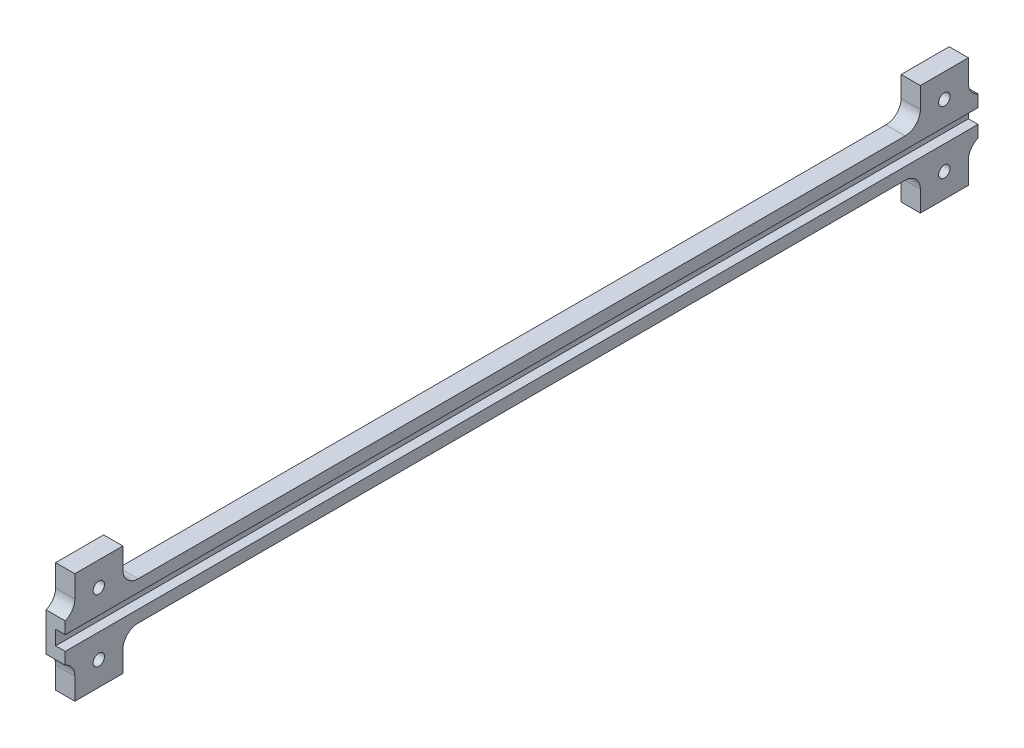
ISO-10303-21;
HEADER;
FILE_DESCRIPTION(('STEP AP214'),'2;1');
FILE_NAME('part.step','',(''),(''),'','','');
FILE_SCHEMA(('AUTOMOTIVE_DESIGN { 1 0 10303 214 1 1 1 1 }'));
ENDSEC;
DATA;
#1=APPLICATION_CONTEXT('core data for automotive mechanical design processes');
#2=APPLICATION_PROTOCOL_DEFINITION('international standard','automotive_design',2000,#1);
#3=PRODUCT_CONTEXT('',#1,'mechanical');
#4=PRODUCT('Part','Part','',(#3));
#5=PRODUCT_RELATED_PRODUCT_CATEGORY('part','',(#4));
#6=PRODUCT_DEFINITION_FORMATION('','',#4);
#7=PRODUCT_DEFINITION_CONTEXT('part definition',#1,'design');
#8=PRODUCT_DEFINITION('design','',#6,#7);
#9=PRODUCT_DEFINITION_SHAPE('','',#8);
#10=(LENGTH_UNIT() NAMED_UNIT(*) SI_UNIT(.MILLI.,.METRE.));
#11=(NAMED_UNIT(*) PLANE_ANGLE_UNIT() SI_UNIT($,.RADIAN.));
#12=(NAMED_UNIT(*) SI_UNIT($,.STERADIAN.) SOLID_ANGLE_UNIT());
#13=UNCERTAINTY_MEASURE_WITH_UNIT(LENGTH_MEASURE(1.E-05),#10,'distance_accuracy_value','');
#14=(GEOMETRIC_REPRESENTATION_CONTEXT(3) GLOBAL_UNCERTAINTY_ASSIGNED_CONTEXT((#13)) GLOBAL_UNIT_ASSIGNED_CONTEXT((#10,
#11,#12)) REPRESENTATION_CONTEXT('',''));
#15=CARTESIAN_POINT('',(0.,0.,0.));
#16=DIRECTION('',(0.,0.,1.));
#17=DIRECTION('',(1.,0.,0.));
#18=AXIS2_PLACEMENT_3D('',#15,#16,#17);
#19=CARTESIAN_POINT('',(-0.999999999999999,-2.,95.));
#20=DIRECTION('',(0.,1.,0.));
#21=DIRECTION('',(0.,0.,1.));
#22=AXIS2_PLACEMENT_3D('',#19,#20,#21);
#23=PLANE('',#22);
#24=DIRECTION('',(0.,0.,-1.));
#25=VECTOR('',#24,1.);
#26=CARTESIAN_POINT('',(1.,-2.,95.));
#27=LINE('',#26,#25);
#28=CARTESIAN_POINT('',(1.,-2.,87.4125));
#29=VERTEX_POINT('',#28);
#30=CARTESIAN_POINT('',(1.,-2.,7.58750000000001));
#31=VERTEX_POINT('',#30);
#32=EDGE_CURVE('E453',#29,#31,#27,.T.);
#33=ORIENTED_EDGE('',*,*,#32,.F.);
#34=DIRECTION('',(-1.,0.,0.));
#35=VECTOR('',#34,1.);
#36=CARTESIAN_POINT('',(-0.999999999999999,-2.,87.4125));
#37=LINE('',#36,#35);
#38=CARTESIAN_POINT('',(-0.999999999999999,-2.,87.4125));
#39=VERTEX_POINT('',#38);
#40=EDGE_CURVE('E469',#29,#39,#37,.T.);
#41=ORIENTED_EDGE('',*,*,#40,.T.);
#42=DIRECTION('',(0.,0.,-1.));
#43=VECTOR('',#42,1.);
#44=CARTESIAN_POINT('',(-0.999999999999999,-2.,95.));
#45=LINE('',#44,#43);
#46=CARTESIAN_POINT('',(-0.999999999999999,-2.,7.58750000000001));
#47=VERTEX_POINT('',#46);
#48=EDGE_CURVE('E457',#39,#47,#45,.T.);
#49=ORIENTED_EDGE('',*,*,#48,.T.);
#50=DIRECTION('',(1.,0.,0.));
#51=VECTOR('',#50,1.);
#52=CARTESIAN_POINT('',(-0.999999999999999,-2.,7.58750000000001));
#53=LINE('',#52,#51);
#54=EDGE_CURVE('E465',#47,#31,#53,.T.);
#55=ORIENTED_EDGE('',*,*,#54,.T.);
#56=EDGE_LOOP('',(#33,#41,#49,#55));
#57=FACE_BOUND('',#56,.T.);
#58=ADVANCED_FACE('F41',(#57),#23,.F.);
#59=CARTESIAN_POINT('',(1.,2.,95.));
#60=DIRECTION('',(0.,-1.,0.));
#61=DIRECTION('',(0.,0.,-1.));
#62=AXIS2_PLACEMENT_3D('',#59,#60,#61);
#63=PLANE('',#62);
#64=DIRECTION('',(0.,0.,-1.));
#65=VECTOR('',#64,1.);
#66=CARTESIAN_POINT('',(-0.999999999999999,2.,95.));
#67=LINE('',#66,#65);
#68=CARTESIAN_POINT('',(-0.999999999999999,2.,87.4125));
#69=VERTEX_POINT('',#68);
#70=CARTESIAN_POINT('',(-0.999999999999999,2.,7.58750000000001));
#71=VERTEX_POINT('',#70);
#72=EDGE_CURVE('E461',#69,#71,#67,.T.);
#73=ORIENTED_EDGE('',*,*,#72,.F.);
#74=DIRECTION('',(1.,0.,0.));
#75=VECTOR('',#74,1.);
#76=CARTESIAN_POINT('',(1.,2.,87.4125));
#77=LINE('',#76,#75);
#78=CARTESIAN_POINT('',(1.,2.,87.4125));
#79=VERTEX_POINT('',#78);
#80=EDGE_CURVE('E480',#69,#79,#77,.T.);
#81=ORIENTED_EDGE('',*,*,#80,.T.);
#82=DIRECTION('',(0.,0.,-1.));
#83=VECTOR('',#82,1.);
#84=CARTESIAN_POINT('',(1.,2.,95.));
#85=LINE('',#84,#83);
#86=CARTESIAN_POINT('',(1.,2.,7.58750000000001));
#87=VERTEX_POINT('',#86);
#88=EDGE_CURVE('E407',#79,#87,#85,.T.);
#89=ORIENTED_EDGE('',*,*,#88,.T.);
#90=DIRECTION('',(-1.,0.,0.));
#91=VECTOR('',#90,1.);
#92=CARTESIAN_POINT('',(1.,2.,7.58750000000001));
#93=LINE('',#92,#91);
#94=EDGE_CURVE('E476',#87,#71,#93,.T.);
#95=ORIENTED_EDGE('',*,*,#94,.T.);
#96=EDGE_LOOP('',(#73,#81,#89,#95));
#97=FACE_BOUND('',#96,.T.);
#98=ADVANCED_FACE('F642',(#97),#63,.F.);
#99=CARTESIAN_POINT('',(-0.999999999999999,2.,95.));
#100=DIRECTION('',(1.,0.,0.));
#101=DIRECTION('',(0.,0.,-1.));
#102=AXIS2_PLACEMENT_3D('',#99,#100,#101);
#103=PLANE('',#102);
#104=CARTESIAN_POINT('',(-0.999999999999999,3.25,91.5));
#105=DIRECTION('',(1.,0.,0.));
#106=DIRECTION('',(0.,0.,-1.));
#107=AXIS2_PLACEMENT_3D('',#104,#105,#106);
#108=CIRCLE('',#107,0.595629999999988);
#109=CARTESIAN_POINT('',(-0.999999999999999,3.25,90.90437));
#110=VERTEX_POINT('',#109);
#111=EDGE_CURVE('E45',#110,#110,#108,.T.);
#112=ORIENTED_EDGE('',*,*,#111,.T.);
#113=EDGE_LOOP('',(#112));
#114=FACE_BOUND('',#113,.T.);
#115=CARTESIAN_POINT('',(-0.999999999999999,-3.25,3.5));
#116=DIRECTION('',(1.,0.,0.));
#117=DIRECTION('',(0.,0.,-1.));
#118=AXIS2_PLACEMENT_3D('',#115,#116,#117);
#119=CIRCLE('',#118,0.595629999999988);
#120=CARTESIAN_POINT('',(-0.999999999999999,-3.25,2.90437000000001));
#121=VERTEX_POINT('',#120);
#122=EDGE_CURVE('E547',#121,#121,#119,.T.);
#123=ORIENTED_EDGE('',*,*,#122,.T.);
#124=EDGE_LOOP('',(#123));
#125=FACE_BOUND('',#124,.T.);
#126=CARTESIAN_POINT('',(-0.999999999999999,-3.25,91.5));
#127=DIRECTION('',(1.,0.,0.));
#128=DIRECTION('',(0.,0.,-1.));
#129=AXIS2_PLACEMENT_3D('',#126,#127,#128);
#130=CIRCLE('',#129,0.595629999999988);
#131=CARTESIAN_POINT('',(-0.999999999999999,-3.25,90.90437));
#132=VERTEX_POINT('',#131);
#133=EDGE_CURVE('E543',#132,#132,#130,.T.);
#134=ORIENTED_EDGE('',*,*,#133,.T.);
#135=EDGE_LOOP('',(#134));
#136=FACE_BOUND('',#135,.T.);
#137=CARTESIAN_POINT('',(-0.999999999999999,3.25,3.5));
#138=DIRECTION('',(1.,0.,0.));
#139=DIRECTION('',(0.,0.,-1.));
#140=AXIS2_PLACEMENT_3D('',#137,#138,#139);
#141=CIRCLE('',#140,0.595629999999988);
#142=CARTESIAN_POINT('',(-0.999999999999999,3.25,2.90437000000001));
#143=VERTEX_POINT('',#142);
#144=EDGE_CURVE('E568',#143,#143,#141,.T.);
#145=ORIENTED_EDGE('',*,*,#144,.T.);
#146=EDGE_LOOP('',(#145));
#147=FACE_BOUND('',#146,.T.);
#148=ORIENTED_EDGE('',*,*,#48,.F.);
#149=CARTESIAN_POINT('',(-0.999999999999999,-3.5875,87.4125));
#150=DIRECTION('',(1.,0.,0.));
#151=DIRECTION('',(0.,0.,-1.));
#152=AXIS2_PLACEMENT_3D('',#149,#150,#151);
#153=CIRCLE('',#152,1.5875);
#154=CARTESIAN_POINT('',(-0.999999999999999,-3.5875,89.));
#155=VERTEX_POINT('',#154);
#156=EDGE_CURVE('E503',#39,#155,#153,.T.);
#157=ORIENTED_EDGE('',*,*,#156,.T.);
#158=DIRECTION('',(0.,-1.,0.));
#159=VECTOR('',#158,1.);
#160=CARTESIAN_POINT('',(-0.999999999999999,-0.75,89.));
#161=LINE('',#160,#159);
#162=CARTESIAN_POINT('',(-0.999999999999999,-5.75,89.));
#163=VERTEX_POINT('',#162);
#164=EDGE_CURVE('E315',#155,#163,#161,.T.);
#165=ORIENTED_EDGE('',*,*,#164,.T.);
#166=DIRECTION('',(0.,0.,1.));
#167=VECTOR('',#166,1.);
#168=CARTESIAN_POINT('',(-0.999999999999999,-5.75,89.));
#169=LINE('',#168,#167);
#170=CARTESIAN_POINT('',(-0.999999999999999,-5.75,94.));
#171=VERTEX_POINT('',#170);
#172=EDGE_CURVE('E574',#163,#171,#169,.T.);
#173=ORIENTED_EDGE('',*,*,#172,.T.);
#174=DIRECTION('',(0.,1.,0.));
#175=VECTOR('',#174,1.);
#176=CARTESIAN_POINT('',(-0.999999999999999,-0.750000000000001,94.));
#177=LINE('',#176,#175);
#178=CARTESIAN_POINT('',(-0.999999999999999,-3.47478812037526,94.));
#179=VERTEX_POINT('',#178);
#180=EDGE_CURVE('E285',#171,#179,#177,.T.);
#181=ORIENTED_EDGE('',*,*,#180,.T.);
#182=CARTESIAN_POINT('',(-0.999999999999999,-3.47478812037526,95.5875));
#183=DIRECTION('',(1.,0.,0.));
#184=DIRECTION('',(0.,0.,-1.));
#185=AXIS2_PLACEMENT_3D('',#182,#183,#184);
#186=CIRCLE('',#185,1.5875);
#187=CARTESIAN_POINT('',(-0.999999999999999,-2.,95.));
#188=VERTEX_POINT('',#187);
#189=EDGE_CURVE('E540',#179,#188,#186,.T.);
#190=ORIENTED_EDGE('',*,*,#189,.T.);
#191=DIRECTION('',(0.,-1.,0.));
#192=VECTOR('',#191,1.);
#193=CARTESIAN_POINT('',(-0.999999999999999,2.,95.));
#194=LINE('',#193,#192);
#195=CARTESIAN_POINT('',(-0.999999999999999,2.,95.));
#196=VERTEX_POINT('',#195);
#197=EDGE_CURVE('E387',#196,#188,#194,.T.);
#198=ORIENTED_EDGE('',*,*,#197,.F.);
#199=CARTESIAN_POINT('',(-0.999999999999999,3.47478812037526,95.5875));
#200=DIRECTION('',(1.,0.,0.));
#201=DIRECTION('',(0.,0.,-1.));
#202=AXIS2_PLACEMENT_3D('',#199,#200,#201);
#203=CIRCLE('',#202,1.5875);
#204=CARTESIAN_POINT('',(-0.999999999999999,3.47478812037526,94.));
#205=VERTEX_POINT('',#204);
#206=EDGE_CURVE('E51',#196,#205,#203,.T.);
#207=ORIENTED_EDGE('',*,*,#206,.T.);
#208=DIRECTION('',(0.,1.,0.));
#209=VECTOR('',#208,1.);
#210=CARTESIAN_POINT('',(-0.999999999999999,5.75,94.));
#211=LINE('',#210,#209);
#212=CARTESIAN_POINT('',(-0.999999999999999,5.75,94.));
#213=VERTEX_POINT('',#212);
#214=EDGE_CURVE('E361',#205,#213,#211,.T.);
#215=ORIENTED_EDGE('',*,*,#214,.T.);
#216=DIRECTION('',(0.,0.,-1.));
#217=VECTOR('',#216,1.);
#218=CARTESIAN_POINT('',(-0.999999999999999,5.75,89.));
#219=LINE('',#218,#217);
#220=CARTESIAN_POINT('',(-0.999999999999999,5.75,89.));
#221=VERTEX_POINT('',#220);
#222=EDGE_CURVE('E358',#213,#221,#219,.T.);
#223=ORIENTED_EDGE('',*,*,#222,.T.);
#224=DIRECTION('',(0.,-1.,0.));
#225=VECTOR('',#224,1.);
#226=CARTESIAN_POINT('',(-0.999999999999999,5.75,89.));
#227=LINE('',#226,#225);
#228=CARTESIAN_POINT('',(-0.999999999999999,3.5875,89.));
#229=VERTEX_POINT('',#228);
#230=EDGE_CURVE('E364',#221,#229,#227,.T.);
#231=ORIENTED_EDGE('',*,*,#230,.T.);
#232=CARTESIAN_POINT('',(-0.999999999999999,3.5875,87.4125));
#233=DIRECTION('',(1.,0.,0.));
#234=DIRECTION('',(0.,0.,-1.));
#235=AXIS2_PLACEMENT_3D('',#232,#233,#234);
#236=CIRCLE('',#235,1.5875);
#237=EDGE_CURVE('E512',#229,#69,#236,.T.);
#238=ORIENTED_EDGE('',*,*,#237,.T.);
#239=ORIENTED_EDGE('',*,*,#72,.T.);
#240=CARTESIAN_POINT('',(-0.999999999999999,3.5875,7.58750000000001));
#241=DIRECTION('',(1.,0.,0.));
#242=DIRECTION('',(0.,0.,-1.));
#243=AXIS2_PLACEMENT_3D('',#240,#241,#242);
#244=CIRCLE('',#243,1.5875);
#245=CARTESIAN_POINT('',(-0.999999999999999,3.5875,6.00000000000001));
#246=VERTEX_POINT('',#245);
#247=EDGE_CURVE('E515',#71,#246,#244,.T.);
#248=ORIENTED_EDGE('',*,*,#247,.T.);
#249=DIRECTION('',(0.,1.,0.));
#250=VECTOR('',#249,1.);
#251=CARTESIAN_POINT('',(-0.999999999999999,5.75,6.00000000000001));
#252=LINE('',#251,#250);
#253=CARTESIAN_POINT('',(-0.999999999999999,5.75,6.00000000000001));
#254=VERTEX_POINT('',#253);
#255=EDGE_CURVE('E334',#246,#254,#252,.T.);
#256=ORIENTED_EDGE('',*,*,#255,.T.);
#257=DIRECTION('',(0.,0.,-1.));
#258=VECTOR('',#257,1.);
#259=CARTESIAN_POINT('',(-0.999999999999999,5.75,6.00000000000001));
#260=LINE('',#259,#258);
#261=CARTESIAN_POINT('',(-0.999999999999999,5.75,1.));
#262=VERTEX_POINT('',#261);
#263=EDGE_CURVE('E332',#254,#262,#260,.T.);
#264=ORIENTED_EDGE('',*,*,#263,.T.);
#265=DIRECTION('',(0.,-1.,0.));
#266=VECTOR('',#265,1.);
#267=CARTESIAN_POINT('',(-0.999999999999999,5.75,1.));
#268=LINE('',#267,#266);
#269=CARTESIAN_POINT('',(-0.999999999999999,3.47478812037526,1.));
#270=VERTEX_POINT('',#269);
#271=EDGE_CURVE('E338',#262,#270,#268,.T.);
#272=ORIENTED_EDGE('',*,*,#271,.T.);
#273=CARTESIAN_POINT('',(-0.999999999999999,3.47478812037526,-0.587499999999999));
#274=DIRECTION('',(1.,0.,0.));
#275=DIRECTION('',(0.,0.,-1.));
#276=AXIS2_PLACEMENT_3D('',#273,#274,#275);
#277=CIRCLE('',#276,1.5875);
#278=CARTESIAN_POINT('',(-0.999999999999999,2.,0.));
#279=VERTEX_POINT('',#278);
#280=EDGE_CURVE('E524',#270,#279,#277,.T.);
#281=ORIENTED_EDGE('',*,*,#280,.T.);
#282=DIRECTION('',(0.,-1.,0.));
#283=VECTOR('',#282,1.);
#284=CARTESIAN_POINT('',(-0.999999999999999,2.,0.));
#285=LINE('',#284,#283);
#286=CARTESIAN_POINT('',(-0.999999999999999,-2.,0.));
#287=VERTEX_POINT('',#286);
#288=EDGE_CURVE('E411',#279,#287,#285,.T.);
#289=ORIENTED_EDGE('',*,*,#288,.T.);
#290=CARTESIAN_POINT('',(-0.999999999999999,-3.47478812037526,-0.587499999999999));
#291=DIRECTION('',(1.,0.,0.));
#292=DIRECTION('',(0.,0.,-1.));
#293=AXIS2_PLACEMENT_3D('',#290,#291,#292);
#294=CIRCLE('',#293,1.5875);
#295=CARTESIAN_POINT('',(-0.999999999999999,-3.47478812037526,1.));
#296=VERTEX_POINT('',#295);
#297=EDGE_CURVE('E527',#287,#296,#294,.T.);
#298=ORIENTED_EDGE('',*,*,#297,.T.);
#299=DIRECTION('',(0.,-1.,0.));
#300=VECTOR('',#299,1.);
#301=CARTESIAN_POINT('',(-0.999999999999999,-0.750000000000001,1.));
#302=LINE('',#301,#300);
#303=CARTESIAN_POINT('',(-0.999999999999999,-5.75,1.));
#304=VERTEX_POINT('',#303);
#305=EDGE_CURVE('E302',#296,#304,#302,.T.);
#306=ORIENTED_EDGE('',*,*,#305,.T.);
#307=DIRECTION('',(0.,0.,1.));
#308=VECTOR('',#307,1.);
#309=CARTESIAN_POINT('',(-0.999999999999999,-5.75,6.));
#310=LINE('',#309,#308);
#311=CARTESIAN_POINT('',(-0.999999999999999,-5.75,6.));
#312=VERTEX_POINT('',#311);
#313=EDGE_CURVE('E310',#304,#312,#310,.T.);
#314=ORIENTED_EDGE('',*,*,#313,.T.);
#315=DIRECTION('',(0.,1.,0.));
#316=VECTOR('',#315,1.);
#317=CARTESIAN_POINT('',(-0.999999999999999,-0.75,6.00000000000001));
#318=LINE('',#317,#316);
#319=CARTESIAN_POINT('',(-0.999999999999999,-3.5875,6.));
#320=VERTEX_POINT('',#319);
#321=EDGE_CURVE('E305',#312,#320,#318,.T.);
#322=ORIENTED_EDGE('',*,*,#321,.T.);
#323=CARTESIAN_POINT('',(-0.999999999999999,-3.5875,7.58750000000001));
#324=DIRECTION('',(1.,0.,0.));
#325=DIRECTION('',(0.,0.,-1.));
#326=AXIS2_PLACEMENT_3D('',#323,#324,#325);
#327=CIRCLE('',#326,1.5875);
#328=EDGE_CURVE('E536',#320,#47,#327,.T.);
#329=ORIENTED_EDGE('',*,*,#328,.T.);
#330=EDGE_LOOP('',(#148,#157,#165,#173,#181,#190,#198,#207,#215,#223,#231,#238,#239,#248,#256,
#264,#272,#281,#289,#298,#306,#314,#322,#329));
#331=FACE_BOUND('',#330,.T.);
#332=ADVANCED_FACE('F587',(#114,#125,#136,#147,#331),#103,.F.);
#333=CARTESIAN_POINT('',(1.,-2.,95.));
#334=DIRECTION('',(-1.,0.,0.));
#335=DIRECTION('',(0.,0.,1.));
#336=AXIS2_PLACEMENT_3D('',#333,#334,#335);
#337=PLANE('',#336);
#338=CARTESIAN_POINT('',(1.,-3.25,3.5));
#339=DIRECTION('',(1.,0.,0.));
#340=DIRECTION('',(0.,0.,-1.));
#341=AXIS2_PLACEMENT_3D('',#338,#339,#340);
#342=CIRCLE('',#341,0.595629999999989);
#343=CARTESIAN_POINT('',(1.,-3.25,2.90437000000001));
#344=VERTEX_POINT('',#343);
#345=EDGE_CURVE('E550',#344,#344,#342,.T.);
#346=ORIENTED_EDGE('',*,*,#345,.F.);
#347=EDGE_LOOP('',(#346));
#348=FACE_BOUND('',#347,.T.);
#349=CARTESIAN_POINT('',(1.,-3.25,91.5));
#350=DIRECTION('',(1.,0.,0.));
#351=DIRECTION('',(0.,0.,-1.));
#352=AXIS2_PLACEMENT_3D('',#349,#350,#351);
#353=CIRCLE('',#352,0.595629999999989);
#354=CARTESIAN_POINT('',(1.,-3.25,90.90437));
#355=VERTEX_POINT('',#354);
#356=EDGE_CURVE('E546',#355,#355,#353,.T.);
#357=ORIENTED_EDGE('',*,*,#356,.F.);
#358=EDGE_LOOP('',(#357));
#359=FACE_BOUND('',#358,.T.);
#360=DIRECTION('',(0.,1.,0.));
#361=VECTOR('',#360,1.);
#362=CARTESIAN_POINT('',(1.,-2.,95.));
#363=LINE('',#362,#361);
#364=CARTESIAN_POINT('',(1.,-2.,95.));
#365=VERTEX_POINT('',#364);
#366=CARTESIAN_POINT('',(1.,-0.75,95.));
#367=VERTEX_POINT('',#366);
#368=EDGE_CURVE('E394',#365,#367,#363,.T.);
#369=ORIENTED_EDGE('',*,*,#368,.F.);
#370=CARTESIAN_POINT('',(1.,-3.47478812037526,95.5875));
#371=DIRECTION('',(-1.,0.,0.));
#372=DIRECTION('',(0.,0.,1.));
#373=AXIS2_PLACEMENT_3D('',#370,#371,#372);
#374=CIRCLE('',#373,1.5875);
#375=CARTESIAN_POINT('',(1.,-3.47478812037526,94.));
#376=VERTEX_POINT('',#375);
#377=EDGE_CURVE('E275',#365,#376,#374,.T.);
#378=ORIENTED_EDGE('',*,*,#377,.T.);
#379=DIRECTION('',(0.,-1.,0.));
#380=VECTOR('',#379,1.);
#381=CARTESIAN_POINT('',(1.,-0.750000000000001,94.));
#382=LINE('',#381,#380);
#383=CARTESIAN_POINT('',(1.,-5.75,94.));
#384=VERTEX_POINT('',#383);
#385=EDGE_CURVE('E268',#376,#384,#382,.T.);
#386=ORIENTED_EDGE('',*,*,#385,.T.);
#387=DIRECTION('',(0.,0.,-1.));
#388=VECTOR('',#387,1.);
#389=CARTESIAN_POINT('',(1.,-5.75,89.));
#390=LINE('',#389,#388);
#391=CARTESIAN_POINT('',(1.,-5.75,89.));
#392=VERTEX_POINT('',#391);
#393=EDGE_CURVE('E274',#384,#392,#390,.T.);
#394=ORIENTED_EDGE('',*,*,#393,.T.);
#395=DIRECTION('',(0.,1.,0.));
#396=VECTOR('',#395,1.);
#397=CARTESIAN_POINT('',(1.,-0.75,89.));
#398=LINE('',#397,#396);
#399=CARTESIAN_POINT('',(1.,-3.5875,89.));
#400=VERTEX_POINT('',#399);
#401=EDGE_CURVE('E278',#392,#400,#398,.T.);
#402=ORIENTED_EDGE('',*,*,#401,.T.);
#403=CARTESIAN_POINT('',(1.,-3.5875,87.4125));
#404=DIRECTION('',(-1.,0.,0.));
#405=DIRECTION('',(0.,0.,1.));
#406=AXIS2_PLACEMENT_3D('',#403,#404,#405);
#407=CIRCLE('',#406,1.5875);
#408=EDGE_CURVE('E506',#400,#29,#407,.T.);
#409=ORIENTED_EDGE('',*,*,#408,.T.);
#410=ORIENTED_EDGE('',*,*,#32,.T.);
#411=CARTESIAN_POINT('',(1.,-3.5875,7.58750000000001));
#412=DIRECTION('',(-1.,0.,0.));
#413=DIRECTION('',(0.,0.,1.));
#414=AXIS2_PLACEMENT_3D('',#411,#412,#413);
#415=CIRCLE('',#414,1.5875);
#416=CARTESIAN_POINT('',(1.,-3.5875,6.));
#417=VERTEX_POINT('',#416);
#418=EDGE_CURVE('E533',#31,#417,#415,.T.);
#419=ORIENTED_EDGE('',*,*,#418,.T.);
#420=DIRECTION('',(0.,-1.,0.));
#421=VECTOR('',#420,1.);
#422=CARTESIAN_POINT('',(1.,-0.75,6.00000000000001));
#423=LINE('',#422,#421);
#424=CARTESIAN_POINT('',(1.,-5.75,6.));
#425=VERTEX_POINT('',#424);
#426=EDGE_CURVE('E311',#417,#425,#423,.T.);
#427=ORIENTED_EDGE('',*,*,#426,.T.);
#428=DIRECTION('',(0.,0.,-1.));
#429=VECTOR('',#428,1.);
#430=CARTESIAN_POINT('',(1.,-5.75,6.));
#431=LINE('',#430,#429);
#432=CARTESIAN_POINT('',(1.,-5.75,1.));
#433=VERTEX_POINT('',#432);
#434=EDGE_CURVE('E314',#425,#433,#431,.T.);
#435=ORIENTED_EDGE('',*,*,#434,.T.);
#436=DIRECTION('',(0.,1.,0.));
#437=VECTOR('',#436,1.);
#438=CARTESIAN_POINT('',(1.,-0.750000000000001,1.));
#439=LINE('',#438,#437);
#440=CARTESIAN_POINT('',(1.,-3.47478812037526,1.));
#441=VERTEX_POINT('',#440);
#442=EDGE_CURVE('E319',#433,#441,#439,.T.);
#443=ORIENTED_EDGE('',*,*,#442,.T.);
#444=CARTESIAN_POINT('',(1.,-3.47478812037526,-0.587499999999999));
#445=DIRECTION('',(-1.,0.,0.));
#446=DIRECTION('',(0.,0.,1.));
#447=AXIS2_PLACEMENT_3D('',#444,#445,#446);
#448=CIRCLE('',#447,1.5875);
#449=CARTESIAN_POINT('',(1.,-2.,0.));
#450=VERTEX_POINT('',#449);
#451=EDGE_CURVE('E530',#441,#450,#448,.T.);
#452=ORIENTED_EDGE('',*,*,#451,.T.);
#453=DIRECTION('',(0.,1.,0.));
#454=VECTOR('',#453,1.);
#455=CARTESIAN_POINT('',(1.,-2.,0.));
#456=LINE('',#455,#454);
#457=CARTESIAN_POINT('',(1.,-0.75,0.));
#458=VERTEX_POINT('',#457);
#459=EDGE_CURVE('E419',#450,#458,#456,.T.);
#460=ORIENTED_EDGE('',*,*,#459,.T.);
#461=DIRECTION('',(0.,0.,-1.));
#462=VECTOR('',#461,1.);
#463=CARTESIAN_POINT('',(1.,-0.75,95.));
#464=LINE('',#463,#462);
#465=EDGE_CURVE('E450',#367,#458,#464,.T.);
#466=ORIENTED_EDGE('',*,*,#465,.F.);
#467=EDGE_LOOP('',(#369,#378,#386,#394,#402,#409,#410,#419,#427,#435,#443,#452,#460,#466));
#468=FACE_BOUND('',#467,.T.);
#469=ADVANCED_FACE('F271',(#348,#359,#468),#337,.F.);
#470=CARTESIAN_POINT('',(1.,-0.75,95.));
#471=DIRECTION('',(0.,-1.,0.));
#472=DIRECTION('',(0.,0.,-1.));
#473=AXIS2_PLACEMENT_3D('',#470,#471,#472);
#474=PLANE('',#473);
#475=ORIENTED_EDGE('',*,*,#465,.T.);
#476=DIRECTION('',(-1.,0.,0.));
#477=VECTOR('',#476,1.);
#478=CARTESIAN_POINT('',(1.,-0.75,0.));
#479=LINE('',#478,#477);
#480=CARTESIAN_POINT('',(0.,-0.75,0.));
#481=VERTEX_POINT('',#480);
#482=EDGE_CURVE('E423',#458,#481,#479,.T.);
#483=ORIENTED_EDGE('',*,*,#482,.T.);
#484=DIRECTION('',(0.,0.,-1.));
#485=VECTOR('',#484,1.);
#486=CARTESIAN_POINT('',(0.,-0.75,95.));
#487=LINE('',#486,#485);
#488=CARTESIAN_POINT('',(0.,-0.75,95.));
#489=VERTEX_POINT('',#488);
#490=EDGE_CURVE('E447',#489,#481,#487,.T.);
#491=ORIENTED_EDGE('',*,*,#490,.F.);
#492=DIRECTION('',(-1.,0.,0.));
#493=VECTOR('',#492,1.);
#494=CARTESIAN_POINT('',(1.,-0.75,95.));
#495=LINE('',#494,#493);
#496=EDGE_CURVE('E396',#367,#489,#495,.T.);
#497=ORIENTED_EDGE('',*,*,#496,.F.);
#498=EDGE_LOOP('',(#475,#483,#491,#497));
#499=FACE_BOUND('',#498,.T.);
#500=ADVANCED_FACE('F621',(#499),#474,.F.);
#501=CARTESIAN_POINT('',(0.,-0.75,95.));
#502=DIRECTION('',(-1.,0.,0.));
#503=DIRECTION('',(0.,0.,1.));
#504=AXIS2_PLACEMENT_3D('',#501,#502,#503);
#505=PLANE('',#504);
#506=DIRECTION('',(0.,1.,0.));
#507=VECTOR('',#506,1.);
#508=CARTESIAN_POINT('',(0.,-0.75,0.));
#509=LINE('',#508,#507);
#510=CARTESIAN_POINT('',(0.,0.75,0.));
#511=VERTEX_POINT('',#510);
#512=EDGE_CURVE('E427',#481,#511,#509,.T.);
#513=ORIENTED_EDGE('',*,*,#512,.T.);
#514=DIRECTION('',(0.,0.,-1.));
#515=VECTOR('',#514,1.);
#516=CARTESIAN_POINT('',(0.,0.75,95.));
#517=LINE('',#516,#515);
#518=CARTESIAN_POINT('',(0.,0.75,95.));
#519=VERTEX_POINT('',#518);
#520=EDGE_CURVE('E444',#519,#511,#517,.T.);
#521=ORIENTED_EDGE('',*,*,#520,.F.);
#522=DIRECTION('',(0.,1.,0.));
#523=VECTOR('',#522,1.);
#524=CARTESIAN_POINT('',(0.,-0.75,95.));
#525=LINE('',#524,#523);
#526=EDGE_CURVE('E398',#489,#519,#525,.T.);
#527=ORIENTED_EDGE('',*,*,#526,.F.);
#528=ORIENTED_EDGE('',*,*,#490,.T.);
#529=EDGE_LOOP('',(#513,#521,#527,#528));
#530=FACE_BOUND('',#529,.T.);
#531=ADVANCED_FACE('F750',(#530),#505,.F.);
#532=CARTESIAN_POINT('',(0.,0.75,95.));
#533=DIRECTION('',(0.,1.,0.));
#534=DIRECTION('',(0.,0.,1.));
#535=AXIS2_PLACEMENT_3D('',#532,#533,#534);
#536=PLANE('',#535);
#537=DIRECTION('',(1.,0.,0.));
#538=VECTOR('',#537,1.);
#539=CARTESIAN_POINT('',(0.,0.75,0.));
#540=LINE('',#539,#538);
#541=CARTESIAN_POINT('',(1.,0.75,0.));
#542=VERTEX_POINT('',#541);
#543=EDGE_CURVE('E431',#511,#542,#540,.T.);
#544=ORIENTED_EDGE('',*,*,#543,.T.);
#545=DIRECTION('',(0.,0.,-1.));
#546=VECTOR('',#545,1.);
#547=CARTESIAN_POINT('',(1.,0.75,95.));
#548=LINE('',#547,#546);
#549=CARTESIAN_POINT('',(1.,0.75,95.));
#550=VERTEX_POINT('',#549);
#551=EDGE_CURVE('E441',#550,#542,#548,.T.);
#552=ORIENTED_EDGE('',*,*,#551,.F.);
#553=DIRECTION('',(1.,0.,0.));
#554=VECTOR('',#553,1.);
#555=CARTESIAN_POINT('',(0.,0.75,95.));
#556=LINE('',#555,#554);
#557=EDGE_CURVE('E400',#519,#550,#556,.T.);
#558=ORIENTED_EDGE('',*,*,#557,.F.);
#559=ORIENTED_EDGE('',*,*,#520,.T.);
#560=EDGE_LOOP('',(#544,#552,#558,#559));
#561=FACE_BOUND('',#560,.T.);
#562=ADVANCED_FACE('F692',(#561),#536,.F.);
#563=CARTESIAN_POINT('',(1.,0.75,95.));
#564=DIRECTION('',(-1.,0.,0.));
#565=DIRECTION('',(0.,0.,1.));
#566=AXIS2_PLACEMENT_3D('',#563,#564,#565);
#567=PLANE('',#566);
#568=CARTESIAN_POINT('',(1.,3.25,91.5));
#569=DIRECTION('',(1.,0.,0.));
#570=DIRECTION('',(0.,0.,-1.));
#571=AXIS2_PLACEMENT_3D('',#568,#569,#570);
#572=CIRCLE('',#571,0.595629999999989);
#573=CARTESIAN_POINT('',(1.,3.25,90.90437));
#574=VERTEX_POINT('',#573);
#575=EDGE_CURVE('E562',#574,#574,#572,.T.);
#576=ORIENTED_EDGE('',*,*,#575,.F.);
#577=EDGE_LOOP('',(#576));
#578=FACE_BOUND('',#577,.T.);
#579=CARTESIAN_POINT('',(1.,3.25,3.5));
#580=DIRECTION('',(1.,0.,0.));
#581=DIRECTION('',(0.,0.,-1.));
#582=AXIS2_PLACEMENT_3D('',#579,#580,#581);
#583=CIRCLE('',#582,0.595629999999989);
#584=CARTESIAN_POINT('',(1.,3.25,2.90437000000001));
#585=VERTEX_POINT('',#584);
#586=EDGE_CURVE('E545',#585,#585,#583,.T.);
#587=ORIENTED_EDGE('',*,*,#586,.F.);
#588=EDGE_LOOP('',(#587));
#589=FACE_BOUND('',#588,.T.);
#590=DIRECTION('',(0.,1.,0.));
#591=VECTOR('',#590,1.);
#592=CARTESIAN_POINT('',(1.,0.75,0.));
#593=LINE('',#592,#591);
#594=CARTESIAN_POINT('',(1.,2.,0.));
#595=VERTEX_POINT('',#594);
#596=EDGE_CURVE('E388',#542,#595,#593,.T.);
#597=ORIENTED_EDGE('',*,*,#596,.T.);
#598=CARTESIAN_POINT('',(1.,3.47478812037526,-0.587499999999999));
#599=DIRECTION('',(-1.,0.,0.));
#600=DIRECTION('',(0.,0.,1.));
#601=AXIS2_PLACEMENT_3D('',#598,#599,#600);
#602=CIRCLE('',#601,1.5875);
#603=CARTESIAN_POINT('',(1.,3.47478812037526,1.));
#604=VERTEX_POINT('',#603);
#605=EDGE_CURVE('E521',#595,#604,#602,.T.);
#606=ORIENTED_EDGE('',*,*,#605,.T.);
#607=DIRECTION('',(0.,1.,0.));
#608=VECTOR('',#607,1.);
#609=CARTESIAN_POINT('',(1.,5.75,1.));
#610=LINE('',#609,#608);
#611=CARTESIAN_POINT('',(1.,5.75,1.));
#612=VERTEX_POINT('',#611);
#613=EDGE_CURVE('E331',#604,#612,#610,.T.);
#614=ORIENTED_EDGE('',*,*,#613,.T.);
#615=DIRECTION('',(0.,0.,1.));
#616=VECTOR('',#615,1.);
#617=CARTESIAN_POINT('',(1.,5.75,6.00000000000001));
#618=LINE('',#617,#616);
#619=CARTESIAN_POINT('',(1.,5.75,6.00000000000001));
#620=VERTEX_POINT('',#619);
#621=EDGE_CURVE('E341',#612,#620,#618,.T.);
#622=ORIENTED_EDGE('',*,*,#621,.T.);
#623=DIRECTION('',(0.,-1.,0.));
#624=VECTOR('',#623,1.);
#625=CARTESIAN_POINT('',(1.,5.75,6.00000000000001));
#626=LINE('',#625,#624);
#627=CARTESIAN_POINT('',(1.,3.5875,6.00000000000001));
#628=VERTEX_POINT('',#627);
#629=EDGE_CURVE('E345',#620,#628,#626,.T.);
#630=ORIENTED_EDGE('',*,*,#629,.T.);
#631=CARTESIAN_POINT('',(1.,3.5875,7.58750000000001));
#632=DIRECTION('',(-1.,0.,0.));
#633=DIRECTION('',(0.,0.,1.));
#634=AXIS2_PLACEMENT_3D('',#631,#632,#633);
#635=CIRCLE('',#634,1.5875);
#636=EDGE_CURVE('E518',#628,#87,#635,.T.);
#637=ORIENTED_EDGE('',*,*,#636,.T.);
#638=ORIENTED_EDGE('',*,*,#88,.F.);
#639=CARTESIAN_POINT('',(1.,3.5875,87.4125));
#640=DIRECTION('',(-1.,0.,0.));
#641=DIRECTION('',(0.,0.,1.));
#642=AXIS2_PLACEMENT_3D('',#639,#640,#641);
#643=CIRCLE('',#642,1.5875);
#644=CARTESIAN_POINT('',(1.,3.5875,89.));
#645=VERTEX_POINT('',#644);
#646=EDGE_CURVE('E509',#79,#645,#643,.T.);
#647=ORIENTED_EDGE('',*,*,#646,.T.);
#648=DIRECTION('',(0.,1.,0.));
#649=VECTOR('',#648,1.);
#650=CARTESIAN_POINT('',(1.,5.75,89.));
#651=LINE('',#650,#649);
#652=CARTESIAN_POINT('',(1.,5.75,89.));
#653=VERTEX_POINT('',#652);
#654=EDGE_CURVE('E357',#645,#653,#651,.T.);
#655=ORIENTED_EDGE('',*,*,#654,.T.);
#656=DIRECTION('',(0.,0.,1.));
#657=VECTOR('',#656,1.);
#658=CARTESIAN_POINT('',(1.,5.75,89.));
#659=LINE('',#658,#657);
#660=CARTESIAN_POINT('',(1.,5.75,94.));
#661=VERTEX_POINT('',#660);
#662=EDGE_CURVE('E367',#653,#661,#659,.T.);
#663=ORIENTED_EDGE('',*,*,#662,.T.);
#664=DIRECTION('',(0.,-1.,0.));
#665=VECTOR('',#664,1.);
#666=CARTESIAN_POINT('',(1.,5.75,94.));
#667=LINE('',#666,#665);
#668=CARTESIAN_POINT('',(1.,3.47478812037526,94.));
#669=VERTEX_POINT('',#668);
#670=EDGE_CURVE('E371',#661,#669,#667,.T.);
#671=ORIENTED_EDGE('',*,*,#670,.T.);
#672=CARTESIAN_POINT('',(1.,3.47478812037526,95.5875));
#673=DIRECTION('',(-1.,0.,0.));
#674=DIRECTION('',(0.,0.,1.));
#675=AXIS2_PLACEMENT_3D('',#672,#673,#674);
#676=CIRCLE('',#675,1.5875);
#677=CARTESIAN_POINT('',(1.,2.,95.));
#678=VERTEX_POINT('',#677);
#679=EDGE_CURVE('E11',#669,#678,#676,.T.);
#680=ORIENTED_EDGE('',*,*,#679,.T.);
#681=DIRECTION('',(0.,1.,0.));
#682=VECTOR('',#681,1.);
#683=CARTESIAN_POINT('',(1.,0.75,95.));
#684=LINE('',#683,#682);
#685=EDGE_CURVE('E403',#550,#678,#684,.T.);
#686=ORIENTED_EDGE('',*,*,#685,.F.);
#687=ORIENTED_EDGE('',*,*,#551,.T.);
#688=EDGE_LOOP('',(#597,#606,#614,#622,#630,#637,#638,#647,#655,#663,#671,#680,#686,#687));
#689=FACE_BOUND('',#688,.T.);
#690=ADVANCED_FACE('F688',(#578,#589,#689),#567,.F.);
#691=CARTESIAN_POINT('',(0.,0.,95.));
#692=DIRECTION('',(0.,0.,1.));
#693=DIRECTION('',(1.,0.,0.));
#694=AXIS2_PLACEMENT_3D('',#691,#692,#693);
#695=PLANE('',#694);
#696=DIRECTION('',(-1.,0.,0.));
#697=VECTOR('',#696,1.);
#698=CARTESIAN_POINT('',(1.,2.,95.));
#699=LINE('',#698,#697);
#700=EDGE_CURVE('E383',#678,#196,#699,.T.);
#701=ORIENTED_EDGE('',*,*,#700,.T.);
#702=ORIENTED_EDGE('',*,*,#197,.T.);
#703=DIRECTION('',(1.,0.,0.));
#704=VECTOR('',#703,1.);
#705=CARTESIAN_POINT('',(-0.999999999999999,-2.,95.));
#706=LINE('',#705,#704);
#707=EDGE_CURVE('E391',#188,#365,#706,.T.);
#708=ORIENTED_EDGE('',*,*,#707,.T.);
#709=ORIENTED_EDGE('',*,*,#368,.T.);
#710=ORIENTED_EDGE('',*,*,#496,.T.);
#711=ORIENTED_EDGE('',*,*,#526,.T.);
#712=ORIENTED_EDGE('',*,*,#557,.T.);
#713=ORIENTED_EDGE('',*,*,#685,.T.);
#714=EDGE_LOOP('',(#701,#702,#708,#709,#710,#711,#712,#713));
#715=FACE_BOUND('',#714,.T.);
#716=ADVANCED_FACE('F624',(#715),#695,.T.);
#717=CARTESIAN_POINT('',(0.,0.,0.));
#718=DIRECTION('',(0.,0.,1.));
#719=DIRECTION('',(1.,0.,0.));
#720=AXIS2_PLACEMENT_3D('',#717,#718,#719);
#721=PLANE('',#720);
#722=DIRECTION('',(-1.,0.,0.));
#723=VECTOR('',#722,1.);
#724=CARTESIAN_POINT('',(1.,2.,0.));
#725=LINE('',#724,#723);
#726=EDGE_CURVE('E382',#595,#279,#725,.T.);
#727=ORIENTED_EDGE('',*,*,#726,.F.);
#728=ORIENTED_EDGE('',*,*,#596,.F.);
#729=ORIENTED_EDGE('',*,*,#543,.F.);
#730=ORIENTED_EDGE('',*,*,#512,.F.);
#731=ORIENTED_EDGE('',*,*,#482,.F.);
#732=ORIENTED_EDGE('',*,*,#459,.F.);
#733=DIRECTION('',(1.,0.,0.));
#734=VECTOR('',#733,1.);
#735=CARTESIAN_POINT('',(-0.999999999999999,-2.,0.));
#736=LINE('',#735,#734);
#737=EDGE_CURVE('E415',#287,#450,#736,.T.);
#738=ORIENTED_EDGE('',*,*,#737,.F.);
#739=ORIENTED_EDGE('',*,*,#288,.F.);
#740=EDGE_LOOP('',(#727,#728,#729,#730,#731,#732,#738,#739));
#741=FACE_BOUND('',#740,.T.);
#742=ADVANCED_FACE('F614',(#741),#721,.F.);
#743=CARTESIAN_POINT('',(-8.07106781186548,5.75,94.));
#744=DIRECTION('',(0.,0.,1.));
#745=DIRECTION('',(1.,0.,0.));
#746=AXIS2_PLACEMENT_3D('',#743,#744,#745);
#747=PLANE('',#746);
#748=ORIENTED_EDGE('',*,*,#214,.F.);
#749=DIRECTION('',(1.,0.,0.));
#750=VECTOR('',#749,1.);
#751=CARTESIAN_POINT('',(1.,3.47478812037526,94.));
#752=LINE('',#751,#750);
#753=EDGE_CURVE('E68',#205,#669,#752,.T.);
#754=ORIENTED_EDGE('',*,*,#753,.T.);
#755=ORIENTED_EDGE('',*,*,#670,.F.);
#756=DIRECTION('',(1.,0.,0.));
#757=VECTOR('',#756,1.);
#758=CARTESIAN_POINT('',(-8.07106781186548,5.75,94.));
#759=LINE('',#758,#757);
#760=EDGE_CURVE('E362',#213,#661,#759,.T.);
#761=ORIENTED_EDGE('',*,*,#760,.F.);
#762=EDGE_LOOP('',(#748,#754,#755,#761));
#763=FACE_BOUND('',#762,.T.);
#764=ADVANCED_FACE('F729',(#763),#747,.T.);
#765=CARTESIAN_POINT('',(-8.07106781186548,5.75,89.));
#766=DIRECTION('',(0.,0.,-1.));
#767=DIRECTION('',(-1.,0.,0.));
#768=AXIS2_PLACEMENT_3D('',#765,#766,#767);
#769=PLANE('',#768);
#770=ORIENTED_EDGE('',*,*,#654,.F.);
#771=DIRECTION('',(1.,0.,0.));
#772=VECTOR('',#771,1.);
#773=CARTESIAN_POINT('',(-8.07106781186548,3.5875,89.));
#774=LINE('',#773,#772);
#775=EDGE_CURVE('E484',#645,#229,#774,.F.);
#776=ORIENTED_EDGE('',*,*,#775,.T.);
#777=ORIENTED_EDGE('',*,*,#230,.F.);
#778=DIRECTION('',(1.,0.,0.));
#779=VECTOR('',#778,1.);
#780=CARTESIAN_POINT('',(-8.07106781186548,5.75,89.));
#781=LINE('',#780,#779);
#782=EDGE_CURVE('E374',#221,#653,#781,.T.);
#783=ORIENTED_EDGE('',*,*,#782,.T.);
#784=EDGE_LOOP('',(#770,#776,#777,#783));
#785=FACE_BOUND('',#784,.T.);
#786=ADVANCED_FACE('F721',(#785),#769,.T.);
#787=CARTESIAN_POINT('',(-8.07106781186548,5.75,89.));
#788=DIRECTION('',(0.,1.,0.));
#789=DIRECTION('',(0.,0.,1.));
#790=AXIS2_PLACEMENT_3D('',#787,#788,#789);
#791=PLANE('',#790);
#792=ORIENTED_EDGE('',*,*,#222,.F.);
#793=ORIENTED_EDGE('',*,*,#760,.T.);
#794=ORIENTED_EDGE('',*,*,#662,.F.);
#795=ORIENTED_EDGE('',*,*,#782,.F.);
#796=EDGE_LOOP('',(#792,#793,#794,#795));
#797=FACE_BOUND('',#796,.T.);
#798=ADVANCED_FACE('F727',(#797),#791,.T.);
#799=CARTESIAN_POINT('',(-8.07106781186548,5.75,6.00000000000001));
#800=DIRECTION('',(0.,0.,1.));
#801=DIRECTION('',(1.,0.,0.));
#802=AXIS2_PLACEMENT_3D('',#799,#800,#801);
#803=PLANE('',#802);
#804=ORIENTED_EDGE('',*,*,#255,.F.);
#805=DIRECTION('',(-1.,0.,0.));
#806=VECTOR('',#805,1.);
#807=CARTESIAN_POINT('',(-8.07106781186548,3.5875,6.00000000000001));
#808=LINE('',#807,#806);
#809=EDGE_CURVE('E487',#246,#628,#808,.F.);
#810=ORIENTED_EDGE('',*,*,#809,.T.);
#811=ORIENTED_EDGE('',*,*,#629,.F.);
#812=DIRECTION('',(1.,0.,0.));
#813=VECTOR('',#812,1.);
#814=CARTESIAN_POINT('',(-8.07106781186548,5.75,6.00000000000001));
#815=LINE('',#814,#813);
#816=EDGE_CURVE('E335',#254,#620,#815,.T.);
#817=ORIENTED_EDGE('',*,*,#816,.F.);
#818=EDGE_LOOP('',(#804,#810,#811,#817));
#819=FACE_BOUND('',#818,.T.);
#820=ADVANCED_FACE('F711',(#819),#803,.T.);
#821=CARTESIAN_POINT('',(-8.07106781186548,5.75,1.));
#822=DIRECTION('',(0.,0.,-1.));
#823=DIRECTION('',(-1.,0.,0.));
#824=AXIS2_PLACEMENT_3D('',#821,#822,#823);
#825=PLANE('',#824);
#826=ORIENTED_EDGE('',*,*,#613,.F.);
#827=DIRECTION('',(1.,0.,0.));
#828=VECTOR('',#827,1.);
#829=CARTESIAN_POINT('',(-0.999999999999999,3.47478812037526,1.));
#830=LINE('',#829,#828);
#831=EDGE_CURVE('E490',#604,#270,#830,.F.);
#832=ORIENTED_EDGE('',*,*,#831,.T.);
#833=ORIENTED_EDGE('',*,*,#271,.F.);
#834=DIRECTION('',(1.,0.,0.));
#835=VECTOR('',#834,1.);
#836=CARTESIAN_POINT('',(-8.07106781186548,5.75,1.));
#837=LINE('',#836,#835);
#838=EDGE_CURVE('E349',#262,#612,#837,.T.);
#839=ORIENTED_EDGE('',*,*,#838,.T.);
#840=EDGE_LOOP('',(#826,#832,#833,#839));
#841=FACE_BOUND('',#840,.T.);
#842=ADVANCED_FACE('F700',(#841),#825,.T.);
#843=CARTESIAN_POINT('',(-8.07106781186548,5.75,6.00000000000001));
#844=DIRECTION('',(0.,1.,0.));
#845=DIRECTION('',(0.,0.,1.));
#846=AXIS2_PLACEMENT_3D('',#843,#844,#845);
#847=PLANE('',#846);
#848=ORIENTED_EDGE('',*,*,#263,.F.);
#849=ORIENTED_EDGE('',*,*,#816,.T.);
#850=ORIENTED_EDGE('',*,*,#621,.F.);
#851=ORIENTED_EDGE('',*,*,#838,.F.);
#852=EDGE_LOOP('',(#848,#849,#850,#851));
#853=FACE_BOUND('',#852,.T.);
#854=ADVANCED_FACE('F707',(#853),#847,.T.);
#855=CARTESIAN_POINT('',(-8.07106781186548,-0.75,6.00000000000001));
#856=DIRECTION('',(0.,0.,1.));
#857=DIRECTION('',(0.,-1.,0.));
#858=AXIS2_PLACEMENT_3D('',#855,#856,#857);
#859=PLANE('',#858);
#860=ORIENTED_EDGE('',*,*,#426,.F.);
#861=DIRECTION('',(1.,0.,0.));
#862=VECTOR('',#861,1.);
#863=CARTESIAN_POINT('',(-8.07106781186548,-3.5875,6.));
#864=LINE('',#863,#862);
#865=EDGE_CURVE('E496',#417,#320,#864,.F.);
#866=ORIENTED_EDGE('',*,*,#865,.T.);
#867=ORIENTED_EDGE('',*,*,#321,.F.);
#868=DIRECTION('',(1.,0.,0.));
#869=VECTOR('',#868,1.);
#870=CARTESIAN_POINT('',(-8.07106781186548,-5.75,6.));
#871=LINE('',#870,#869);
#872=EDGE_CURVE('E323',#312,#425,#871,.T.);
#873=ORIENTED_EDGE('',*,*,#872,.T.);
#874=EDGE_LOOP('',(#860,#866,#867,#873));
#875=FACE_BOUND('',#874,.T.);
#876=ADVANCED_FACE('F596',(#875),#859,.T.);
#877=CARTESIAN_POINT('',(-8.07106781186548,-0.750000000000001,1.));
#878=DIRECTION('',(0.,0.,-1.));
#879=DIRECTION('',(-1.,0.,0.));
#880=AXIS2_PLACEMENT_3D('',#877,#878,#879);
#881=PLANE('',#880);
#882=ORIENTED_EDGE('',*,*,#305,.F.);
#883=DIRECTION('',(-1.,0.,0.));
#884=VECTOR('',#883,1.);
#885=CARTESIAN_POINT('',(1.,-3.47478812037526,1.));
#886=LINE('',#885,#884);
#887=EDGE_CURVE('E493',#296,#441,#886,.F.);
#888=ORIENTED_EDGE('',*,*,#887,.T.);
#889=ORIENTED_EDGE('',*,*,#442,.F.);
#890=DIRECTION('',(1.,0.,0.));
#891=VECTOR('',#890,1.);
#892=CARTESIAN_POINT('',(-8.07106781186548,-5.75,1.));
#893=LINE('',#892,#891);
#894=EDGE_CURVE('E306',#304,#433,#893,.T.);
#895=ORIENTED_EDGE('',*,*,#894,.F.);
#896=EDGE_LOOP('',(#882,#888,#889,#895));
#897=FACE_BOUND('',#896,.T.);
#898=ADVANCED_FACE('F638',(#897),#881,.T.);
#899=CARTESIAN_POINT('',(-8.07106781186548,-5.75,6.));
#900=DIRECTION('',(0.,-1.,0.));
#901=DIRECTION('',(0.,0.,-1.));
#902=AXIS2_PLACEMENT_3D('',#899,#900,#901);
#903=PLANE('',#902);
#904=ORIENTED_EDGE('',*,*,#313,.F.);
#905=ORIENTED_EDGE('',*,*,#894,.T.);
#906=ORIENTED_EDGE('',*,*,#434,.F.);
#907=ORIENTED_EDGE('',*,*,#872,.F.);
#908=EDGE_LOOP('',(#904,#905,#906,#907));
#909=FACE_BOUND('',#908,.T.);
#910=ADVANCED_FACE('F601',(#909),#903,.T.);
#911=CARTESIAN_POINT('',(-8.07106781186548,-0.75,89.));
#912=DIRECTION('',(0.,0.,-1.));
#913=DIRECTION('',(-1.,0.,0.));
#914=AXIS2_PLACEMENT_3D('',#911,#912,#913);
#915=PLANE('',#914);
#916=ORIENTED_EDGE('',*,*,#164,.F.);
#917=DIRECTION('',(-1.,0.,0.));
#918=VECTOR('',#917,1.);
#919=CARTESIAN_POINT('',(-8.07106781186548,-3.5875,89.));
#920=LINE('',#919,#918);
#921=EDGE_CURVE('E473',#155,#400,#920,.F.);
#922=ORIENTED_EDGE('',*,*,#921,.T.);
#923=ORIENTED_EDGE('',*,*,#401,.F.);
#924=DIRECTION('',(1.,0.,0.));
#925=VECTOR('',#924,1.);
#926=CARTESIAN_POINT('',(-8.07106781186548,-5.75,89.));
#927=LINE('',#926,#925);
#928=EDGE_CURVE('E289',#163,#392,#927,.T.);
#929=ORIENTED_EDGE('',*,*,#928,.F.);
#930=EDGE_LOOP('',(#916,#922,#923,#929));
#931=FACE_BOUND('',#930,.T.);
#932=ADVANCED_FACE('F630',(#931),#915,.T.);
#933=CARTESIAN_POINT('',(-8.07106781186548,-0.750000000000001,94.));
#934=DIRECTION('',(0.,0.,1.));
#935=DIRECTION('',(1.,0.,0.));
#936=AXIS2_PLACEMENT_3D('',#933,#934,#935);
#937=PLANE('',#936);
#938=ORIENTED_EDGE('',*,*,#385,.F.);
#939=DIRECTION('',(-1.,0.,0.));
#940=VECTOR('',#939,1.);
#941=CARTESIAN_POINT('',(-0.999999999999999,-3.47478812037526,94.));
#942=LINE('',#941,#940);
#943=EDGE_CURVE('E499',#376,#179,#942,.T.);
#944=ORIENTED_EDGE('',*,*,#943,.T.);
#945=ORIENTED_EDGE('',*,*,#180,.F.);
#946=DIRECTION('',(1.,0.,0.));
#947=VECTOR('',#946,1.);
#948=CARTESIAN_POINT('',(-8.07106781186548,-5.75,94.));
#949=LINE('',#948,#947);
#950=EDGE_CURVE('E282',#171,#384,#949,.T.);
#951=ORIENTED_EDGE('',*,*,#950,.T.);
#952=EDGE_LOOP('',(#938,#944,#945,#951));
#953=FACE_BOUND('',#952,.T.);
#954=ADVANCED_FACE('F283',(#953),#937,.T.);
#955=CARTESIAN_POINT('',(-8.07106781186548,-5.75,89.));
#956=DIRECTION('',(0.,-1.,0.));
#957=DIRECTION('',(0.,0.,-1.));
#958=AXIS2_PLACEMENT_3D('',#955,#956,#957);
#959=PLANE('',#958);
#960=ORIENTED_EDGE('',*,*,#172,.F.);
#961=ORIENTED_EDGE('',*,*,#928,.T.);
#962=ORIENTED_EDGE('',*,*,#393,.F.);
#963=ORIENTED_EDGE('',*,*,#950,.F.);
#964=EDGE_LOOP('',(#960,#961,#962,#963));
#965=FACE_BOUND('',#964,.T.);
#966=ADVANCED_FACE('F291',(#965),#959,.T.);
#967=CARTESIAN_POINT('',(-0.999999999999999,-3.5875,87.4125));
#968=DIRECTION('',(-1.,0.,0.));
#969=DIRECTION('',(0.,0.,1.));
#970=AXIS2_PLACEMENT_3D('',#967,#968,#969);
#971=CYLINDRICAL_SURFACE('',#970,1.5875);
#972=ORIENTED_EDGE('',*,*,#408,.F.);
#973=ORIENTED_EDGE('',*,*,#921,.F.);
#974=ORIENTED_EDGE('',*,*,#156,.F.);
#975=ORIENTED_EDGE('',*,*,#40,.F.);
#976=EDGE_LOOP('',(#972,#973,#974,#975));
#977=FACE_BOUND('',#976,.T.);
#978=ADVANCED_FACE('F583',(#977),#971,.F.);
#979=CARTESIAN_POINT('',(1.,3.5875,87.4125));
#980=DIRECTION('',(1.,0.,0.));
#981=DIRECTION('',(0.,0.,-1.));
#982=AXIS2_PLACEMENT_3D('',#979,#980,#981);
#983=CYLINDRICAL_SURFACE('',#982,1.5875);
#984=ORIENTED_EDGE('',*,*,#237,.F.);
#985=ORIENTED_EDGE('',*,*,#775,.F.);
#986=ORIENTED_EDGE('',*,*,#646,.F.);
#987=ORIENTED_EDGE('',*,*,#80,.F.);
#988=EDGE_LOOP('',(#984,#985,#986,#987));
#989=FACE_BOUND('',#988,.T.);
#990=ADVANCED_FACE('F657',(#989),#983,.F.);
#991=CARTESIAN_POINT('',(1.,3.5875,7.58750000000001));
#992=DIRECTION('',(-1.,0.,0.));
#993=DIRECTION('',(0.,0.,1.));
#994=AXIS2_PLACEMENT_3D('',#991,#992,#993);
#995=CYLINDRICAL_SURFACE('',#994,1.5875);
#996=ORIENTED_EDGE('',*,*,#636,.F.);
#997=ORIENTED_EDGE('',*,*,#809,.F.);
#998=ORIENTED_EDGE('',*,*,#247,.F.);
#999=ORIENTED_EDGE('',*,*,#94,.F.);
#1000=EDGE_LOOP('',(#996,#997,#998,#999));
#1001=FACE_BOUND('',#1000,.T.);
#1002=ADVANCED_FACE('F660',(#1001),#995,.F.);
#1003=CARTESIAN_POINT('',(1.,3.47478812037526,-0.587499999999999));
#1004=DIRECTION('',(-1.,0.,0.));
#1005=DIRECTION('',(0.,0.,1.));
#1006=AXIS2_PLACEMENT_3D('',#1003,#1004,#1005);
#1007=CYLINDRICAL_SURFACE('',#1006,1.5875);
#1008=ORIENTED_EDGE('',*,*,#280,.F.);
#1009=ORIENTED_EDGE('',*,*,#831,.F.);
#1010=ORIENTED_EDGE('',*,*,#605,.F.);
#1011=ORIENTED_EDGE('',*,*,#726,.T.);
#1012=EDGE_LOOP('',(#1008,#1009,#1010,#1011));
#1013=FACE_BOUND('',#1012,.T.);
#1014=ADVANCED_FACE('F664',(#1013),#1007,.F.);
#1015=CARTESIAN_POINT('',(-0.999999999999999,-3.47478812037526,-0.587499999999999));
#1016=DIRECTION('',(1.,0.,0.));
#1017=DIRECTION('',(0.,0.,-1.));
#1018=AXIS2_PLACEMENT_3D('',#1015,#1016,#1017);
#1019=CYLINDRICAL_SURFACE('',#1018,1.5875);
#1020=ORIENTED_EDGE('',*,*,#451,.F.);
#1021=ORIENTED_EDGE('',*,*,#887,.F.);
#1022=ORIENTED_EDGE('',*,*,#297,.F.);
#1023=ORIENTED_EDGE('',*,*,#737,.T.);
#1024=EDGE_LOOP('',(#1020,#1021,#1022,#1023));
#1025=FACE_BOUND('',#1024,.T.);
#1026=ADVANCED_FACE('F609',(#1025),#1019,.F.);
#1027=CARTESIAN_POINT('',(-0.999999999999999,-3.5875,7.58750000000001));
#1028=DIRECTION('',(1.,0.,0.));
#1029=DIRECTION('',(0.,0.,-1.));
#1030=AXIS2_PLACEMENT_3D('',#1027,#1028,#1029);
#1031=CYLINDRICAL_SURFACE('',#1030,1.5875);
#1032=ORIENTED_EDGE('',*,*,#328,.F.);
#1033=ORIENTED_EDGE('',*,*,#865,.F.);
#1034=ORIENTED_EDGE('',*,*,#418,.F.);
#1035=ORIENTED_EDGE('',*,*,#54,.F.);
#1036=EDGE_LOOP('',(#1032,#1033,#1034,#1035));
#1037=FACE_BOUND('',#1036,.T.);
#1038=ADVANCED_FACE('F593',(#1037),#1031,.F.);
#1039=CARTESIAN_POINT('',(-0.999999999999999,-3.47478812037526,95.5875));
#1040=DIRECTION('',(1.,0.,0.));
#1041=DIRECTION('',(0.,0.,-1.));
#1042=AXIS2_PLACEMENT_3D('',#1039,#1040,#1041);
#1043=CYLINDRICAL_SURFACE('',#1042,1.5875);
#1044=ORIENTED_EDGE('',*,*,#189,.F.);
#1045=ORIENTED_EDGE('',*,*,#943,.F.);
#1046=ORIENTED_EDGE('',*,*,#377,.F.);
#1047=ORIENTED_EDGE('',*,*,#707,.F.);
#1048=EDGE_LOOP('',(#1044,#1045,#1046,#1047));
#1049=FACE_BOUND('',#1048,.T.);
#1050=ADVANCED_FACE('F629',(#1049),#1043,.F.);
#1051=CARTESIAN_POINT('',(1.,3.47478812037526,95.5875));
#1052=DIRECTION('',(-1.,0.,0.));
#1053=DIRECTION('',(0.,0.,1.));
#1054=AXIS2_PLACEMENT_3D('',#1051,#1052,#1053);
#1055=CYLINDRICAL_SURFACE('',#1054,1.5875);
#1056=ORIENTED_EDGE('',*,*,#679,.F.);
#1057=ORIENTED_EDGE('',*,*,#753,.F.);
#1058=ORIENTED_EDGE('',*,*,#206,.F.);
#1059=ORIENTED_EDGE('',*,*,#700,.F.);
#1060=EDGE_LOOP('',(#1056,#1057,#1058,#1059));
#1061=FACE_BOUND('',#1060,.T.);
#1062=ADVANCED_FACE('F43',(#1061),#1055,.F.);
#1063=CARTESIAN_POINT('',(1.,3.25,3.5));
#1064=DIRECTION('',(1.,0.,0.));
#1065=DIRECTION('',(0.,0.,-1.));
#1066=AXIS2_PLACEMENT_3D('',#1063,#1064,#1065);
#1067=CYLINDRICAL_SURFACE('',#1066,0.595629999999988);
#1068=ORIENTED_EDGE('',*,*,#586,.T.);
#1069=EDGE_LOOP('',(#1068));
#1070=FACE_BOUND('',#1069,.T.);
#1071=ORIENTED_EDGE('',*,*,#144,.F.);
#1072=EDGE_LOOP('',(#1071));
#1073=FACE_BOUND('',#1072,.T.);
#1074=ADVANCED_FACE('F676',(#1070,#1073),#1067,.F.);
#1075=CARTESIAN_POINT('',(1.,-3.25,91.5));
#1076=DIRECTION('',(1.,0.,0.));
#1077=DIRECTION('',(0.,0.,-1.));
#1078=AXIS2_PLACEMENT_3D('',#1075,#1076,#1077);
#1079=CYLINDRICAL_SURFACE('',#1078,0.595629999999988);
#1080=ORIENTED_EDGE('',*,*,#356,.T.);
#1081=EDGE_LOOP('',(#1080));
#1082=FACE_BOUND('',#1081,.T.);
#1083=ORIENTED_EDGE('',*,*,#133,.F.);
#1084=EDGE_LOOP('',(#1083));
#1085=FACE_BOUND('',#1084,.T.);
#1086=ADVANCED_FACE('F681',(#1082,#1085),#1079,.F.);
#1087=CARTESIAN_POINT('',(1.,-3.25,3.5));
#1088=DIRECTION('',(1.,0.,0.));
#1089=DIRECTION('',(0.,0.,-1.));
#1090=AXIS2_PLACEMENT_3D('',#1087,#1088,#1089);
#1091=CYLINDRICAL_SURFACE('',#1090,0.595629999999988);
#1092=ORIENTED_EDGE('',*,*,#345,.T.);
#1093=EDGE_LOOP('',(#1092));
#1094=FACE_BOUND('',#1093,.T.);
#1095=ORIENTED_EDGE('',*,*,#122,.F.);
#1096=EDGE_LOOP('',(#1095));
#1097=FACE_BOUND('',#1096,.T.);
#1098=ADVANCED_FACE('F765',(#1094,#1097),#1091,.F.);
#1099=CARTESIAN_POINT('',(1.,3.25,91.5));
#1100=DIRECTION('',(1.,0.,0.));
#1101=DIRECTION('',(0.,0.,-1.));
#1102=AXIS2_PLACEMENT_3D('',#1099,#1100,#1101);
#1103=CYLINDRICAL_SURFACE('',#1102,0.595629999999988);
#1104=ORIENTED_EDGE('',*,*,#575,.T.);
#1105=EDGE_LOOP('',(#1104));
#1106=FACE_BOUND('',#1105,.T.);
#1107=ORIENTED_EDGE('',*,*,#111,.F.);
#1108=EDGE_LOOP('',(#1107));
#1109=FACE_BOUND('',#1108,.T.);
#1110=ADVANCED_FACE('F775',(#1106,#1109),#1103,.F.);
#1111=CLOSED_SHELL('',(#58,#98,#332,#469,#500,#531,#562,#690,#716,#742,#764,#786,#798,#820,#842,
#854,#876,#898,#910,#932,#954,#966,#978,#990,#1002,#1014,#1026,#1038,#1050,#1062,#1074,#1086,
#1098,#1110));
#1112=MANIFOLD_SOLID_BREP('B2',#1111);
#1113=ADVANCED_BREP_SHAPE_REPRESENTATION('',(#18,#1112),#14);
#1114=SHAPE_DEFINITION_REPRESENTATION(#9,#1113);
ENDSEC;
END-ISO-10303-21;
